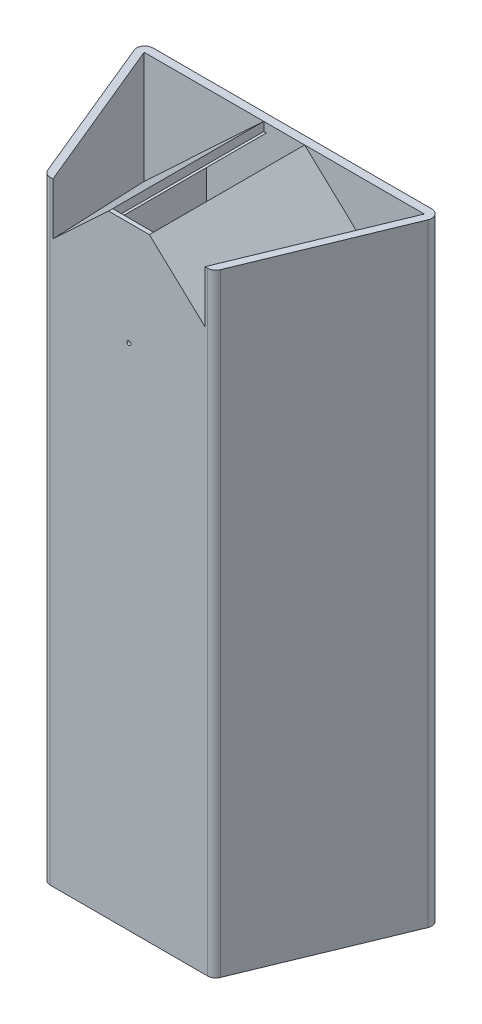
ISO-10303-21;
HEADER;
FILE_DESCRIPTION(('STEP AP214'),'2;1');
FILE_NAME('part.step','',(''),(''),'','','');
FILE_SCHEMA(('AUTOMOTIVE_DESIGN { 1 0 10303 214 1 1 1 1 }'));
ENDSEC;
DATA;
#1=APPLICATION_CONTEXT('core data for automotive mechanical design processes');
#2=APPLICATION_PROTOCOL_DEFINITION('international standard','automotive_design',2000,#1);
#3=PRODUCT_CONTEXT('',#1,'mechanical');
#4=PRODUCT('Part','Part','',(#3));
#5=PRODUCT_RELATED_PRODUCT_CATEGORY('part','',(#4));
#6=PRODUCT_DEFINITION_FORMATION('','',#4);
#7=PRODUCT_DEFINITION_CONTEXT('part definition',#1,'design');
#8=PRODUCT_DEFINITION('design','',#6,#7);
#9=PRODUCT_DEFINITION_SHAPE('','',#8);
#10=(LENGTH_UNIT() NAMED_UNIT(*) SI_UNIT(.MILLI.,.METRE.));
#11=(NAMED_UNIT(*) PLANE_ANGLE_UNIT() SI_UNIT($,.RADIAN.));
#12=(NAMED_UNIT(*) SI_UNIT($,.STERADIAN.) SOLID_ANGLE_UNIT());
#13=UNCERTAINTY_MEASURE_WITH_UNIT(LENGTH_MEASURE(1.E-05),#10,'distance_accuracy_value','');
#14=(GEOMETRIC_REPRESENTATION_CONTEXT(3) GLOBAL_UNCERTAINTY_ASSIGNED_CONTEXT((#13)) GLOBAL_UNIT_ASSIGNED_CONTEXT((#10,
#11,#12)) REPRESENTATION_CONTEXT('',''));
#15=CARTESIAN_POINT('',(0.,0.,0.));
#16=DIRECTION('',(0.,0.,1.));
#17=DIRECTION('',(1.,0.,0.));
#18=AXIS2_PLACEMENT_3D('',#15,#16,#17);
#19=CARTESIAN_POINT('',(185.5,-127.482593081936,176.515464620892));
#20=DIRECTION('',(0.,0.,1.));
#21=DIRECTION('',(1.,0.,0.));
#22=AXIS2_PLACEMENT_3D('',#19,#20,#21);
#23=CYLINDRICAL_SURFACE('',#22,10.);
#24=CARTESIAN_POINT('',(185.5,-127.482593081936,0.));
#25=DIRECTION('',(0.,0.,-1.));
#26=DIRECTION('',(1.,0.,0.));
#27=AXIS2_PLACEMENT_3D('',#24,#25,#26);
#28=CIRCLE('',#27,10.);
#29=CARTESIAN_POINT('',(195.5,-127.482593081936,0.));
#30=VERTEX_POINT('',#29);
#31=EDGE_CURVE('E450',#30,#30,#28,.T.);
#32=ORIENTED_EDGE('',*,*,#31,.T.);
#33=EDGE_LOOP('',(#32));
#34=FACE_BOUND('',#33,.T.);
#35=CARTESIAN_POINT('',(185.5,-127.482593081936,10.));
#36=DIRECTION('',(0.,0.,-1.));
#37=DIRECTION('',(1.,0.,0.));
#38=AXIS2_PLACEMENT_3D('',#35,#36,#37);
#39=CIRCLE('',#38,10.);
#40=CARTESIAN_POINT('',(195.5,-127.482593081936,10.));
#41=VERTEX_POINT('',#40);
#42=EDGE_CURVE('E467',#41,#41,#39,.T.);
#43=ORIENTED_EDGE('',*,*,#42,.F.);
#44=EDGE_LOOP('',(#43));
#45=FACE_BOUND('',#44,.T.);
#46=ADVANCED_FACE('F15',(#34,#45),#23,.F.);
#47=CARTESIAN_POINT('',(185.5,-127.482593081936,176.515464620892));
#48=DIRECTION('',(0.,0.,1.));
#49=DIRECTION('',(1.,0.,0.));
#50=AXIS2_PLACEMENT_3D('',#47,#48,#49);
#51=CYLINDRICAL_SURFACE('',#50,2.5);
#52=CARTESIAN_POINT('',(185.5,-127.482593081936,200.));
#53=DIRECTION('',(0.,0.,-1.));
#54=DIRECTION('',(-1.,0.,0.));
#55=AXIS2_PLACEMENT_3D('',#52,#53,#54);
#56=CIRCLE('',#55,2.5);
#57=CARTESIAN_POINT('',(183.,-127.482593081936,200.));
#58=VERTEX_POINT('',#57);
#59=EDGE_CURVE('E484',#58,#58,#56,.T.);
#60=ORIENTED_EDGE('',*,*,#59,.F.);
#61=EDGE_LOOP('',(#60));
#62=FACE_BOUND('',#61,.T.);
#63=CARTESIAN_POINT('',(185.5,-127.482593081936,190.));
#64=DIRECTION('',(0.,0.,1.));
#65=DIRECTION('',(-1.,0.,0.));
#66=AXIS2_PLACEMENT_3D('',#63,#64,#65);
#67=CIRCLE('',#66,2.5);
#68=CARTESIAN_POINT('',(183.,-127.482593081936,190.));
#69=VERTEX_POINT('',#68);
#70=EDGE_CURVE('E582',#69,#69,#67,.T.);
#71=ORIENTED_EDGE('',*,*,#70,.F.);
#72=EDGE_LOOP('',(#71));
#73=FACE_BOUND('',#72,.T.);
#74=ADVANCED_FACE('F893',(#62,#73),#51,.F.);
#75=CARTESIAN_POINT('',(0.,-10.7827517086493,0.));
#76=DIRECTION('',(0.,1.,0.));
#77=DIRECTION('',(1.,0.,0.));
#78=AXIS2_PLACEMENT_3D('',#75,#76,#77);
#79=PLANE('',#78);
#80=DIRECTION('',(-1.,0.,0.));
#81=VECTOR('',#80,1.);
#82=CARTESIAN_POINT('',(185.5,-10.7827517086493,10.));
#83=LINE('',#82,#81);
#84=CARTESIAN_POINT('',(163.607932789272,-10.7827517086493,10.));
#85=VERTEX_POINT('',#84);
#86=CARTESIAN_POINT('',(160.5,-10.7827517086493,10.));
#87=VERTEX_POINT('',#86);
#88=EDGE_CURVE('E470',#85,#87,#83,.T.);
#89=ORIENTED_EDGE('',*,*,#88,.T.);
#90=DIRECTION('',(0.,0.,1.));
#91=VECTOR('',#90,1.);
#92=CARTESIAN_POINT('',(160.5,-10.7827517086493,125.));
#93=LINE('',#92,#91);
#94=CARTESIAN_POINT('',(160.5,-10.7827517086493,195.));
#95=VERTEX_POINT('',#94);
#96=EDGE_CURVE('E10',#87,#95,#93,.T.);
#97=ORIENTED_EDGE('',*,*,#96,.T.);
#98=DIRECTION('',(1.,0.,0.));
#99=VECTOR('',#98,1.);
#100=CARTESIAN_POINT('',(185.5,-10.7827517086493,195.));
#101=LINE('',#100,#99);
#102=CARTESIAN_POINT('',(210.5,-10.7827517086493,195.));
#103=VERTEX_POINT('',#102);
#104=EDGE_CURVE('E333',#95,#103,#101,.T.);
#105=ORIENTED_EDGE('',*,*,#104,.T.);
#106=DIRECTION('',(0.,0.,-1.));
#107=VECTOR('',#106,1.);
#108=CARTESIAN_POINT('',(210.5,-10.7827517086493,125.));
#109=LINE('',#108,#107);
#110=CARTESIAN_POINT('',(210.5,-10.7827517086493,10.));
#111=VERTEX_POINT('',#110);
#112=EDGE_CURVE('E26',#103,#111,#109,.T.);
#113=ORIENTED_EDGE('',*,*,#112,.T.);
#114=DIRECTION('',(-1.,0.,0.));
#115=VECTOR('',#114,1.);
#116=CARTESIAN_POINT('',(185.5,-10.7827517086493,10.));
#117=LINE('',#116,#115);
#118=CARTESIAN_POINT('',(207.392067210728,-10.7827517086493,10.));
#119=VERTEX_POINT('',#118);
#120=EDGE_CURVE('E345',#111,#119,#117,.T.);
#121=ORIENTED_EDGE('',*,*,#120,.T.);
#122=DIRECTION('',(0.,0.,1.));
#123=VECTOR('',#122,1.);
#124=CARTESIAN_POINT('',(207.392067210728,-10.7827517086493,323.478380407426));
#125=LINE('',#124,#123);
#126=CARTESIAN_POINT('',(207.392067210728,-10.7827517086493,190.));
#127=VERTEX_POINT('',#126);
#128=EDGE_CURVE('E324',#119,#127,#125,.T.);
#129=ORIENTED_EDGE('',*,*,#128,.T.);
#130=DIRECTION('',(1.,0.,0.));
#131=VECTOR('',#130,1.);
#132=CARTESIAN_POINT('',(185.5,-10.7827517086493,190.));
#133=LINE('',#132,#131);
#134=CARTESIAN_POINT('',(163.607932789272,-10.7827517086493,190.));
#135=VERTEX_POINT('',#134);
#136=EDGE_CURVE('E547',#135,#127,#133,.T.);
#137=ORIENTED_EDGE('',*,*,#136,.F.);
#138=DIRECTION('',(0.,0.,1.));
#139=VECTOR('',#138,1.);
#140=CARTESIAN_POINT('',(163.607932789272,-10.7827517086493,323.478380407426));
#141=LINE('',#140,#139);
#142=EDGE_CURVE('E446',#85,#135,#141,.T.);
#143=ORIENTED_EDGE('',*,*,#142,.F.);
#144=EDGE_LOOP('',(#89,#97,#105,#113,#121,#129,#137,#143));
#145=FACE_BOUND('',#144,.T.);
#146=ADVANCED_FACE('F696',(#145),#79,.T.);
#147=CARTESIAN_POINT('',(160.5,-10.7827517086493,125.));
#148=DIRECTION('',(-1.,0.,0.));
#149=DIRECTION('',(0.,0.,1.));
#150=AXIS2_PLACEMENT_3D('',#147,#148,#149);
#151=PLANE('',#150);
#152=DIRECTION('',(0.,0.,1.));
#153=VECTOR('',#152,1.);
#154=CARTESIAN_POINT('',(160.5,0.,125.));
#155=LINE('',#154,#153);
#156=CARTESIAN_POINT('',(160.5,0.,10.));
#157=VERTEX_POINT('',#156);
#158=CARTESIAN_POINT('',(160.5,0.,195.));
#159=VERTEX_POINT('',#158);
#160=EDGE_CURVE('E426',#157,#159,#155,.T.);
#161=ORIENTED_EDGE('',*,*,#160,.T.);
#162=DIRECTION('',(0.,1.,0.));
#163=VECTOR('',#162,1.);
#164=CARTESIAN_POINT('',(160.5,-10.7827517086493,195.));
#165=LINE('',#164,#163);
#166=EDGE_CURVE('E388',#95,#159,#165,.T.);
#167=ORIENTED_EDGE('',*,*,#166,.F.);
#168=ORIENTED_EDGE('',*,*,#96,.F.);
#169=DIRECTION('',(0.,1.,0.));
#170=VECTOR('',#169,1.);
#171=CARTESIAN_POINT('',(160.5,-10.7827517086493,10.));
#172=LINE('',#171,#170);
#173=EDGE_CURVE('E330',#87,#157,#172,.T.);
#174=ORIENTED_EDGE('',*,*,#173,.T.);
#175=EDGE_LOOP('',(#161,#167,#168,#174));
#176=FACE_BOUND('',#175,.T.);
#177=ADVANCED_FACE('F892',(#176),#151,.F.);
#178=CARTESIAN_POINT('',(210.5,-10.7827517086493,125.));
#179=DIRECTION('',(1.,0.,0.));
#180=DIRECTION('',(0.,1.,0.));
#181=AXIS2_PLACEMENT_3D('',#178,#179,#180);
#182=PLANE('',#181);
#183=DIRECTION('',(0.,0.,-1.));
#184=VECTOR('',#183,1.);
#185=CARTESIAN_POINT('',(210.5,0.,125.));
#186=LINE('',#185,#184);
#187=CARTESIAN_POINT('',(210.5,0.,195.));
#188=VERTEX_POINT('',#187);
#189=CARTESIAN_POINT('',(210.5,0.,10.));
#190=VERTEX_POINT('',#189);
#191=EDGE_CURVE('E422',#188,#190,#186,.T.);
#192=ORIENTED_EDGE('',*,*,#191,.T.);
#193=DIRECTION('',(0.,1.,0.));
#194=VECTOR('',#193,1.);
#195=CARTESIAN_POINT('',(210.5,-10.7827517086493,10.));
#196=LINE('',#195,#194);
#197=EDGE_CURVE('E334',#111,#190,#196,.T.);
#198=ORIENTED_EDGE('',*,*,#197,.F.);
#199=ORIENTED_EDGE('',*,*,#112,.F.);
#200=DIRECTION('',(0.,1.,0.));
#201=VECTOR('',#200,1.);
#202=CARTESIAN_POINT('',(210.5,-10.7827517086493,195.));
#203=LINE('',#202,#201);
#204=EDGE_CURVE('E402',#103,#188,#203,.T.);
#205=ORIENTED_EDGE('',*,*,#204,.T.);
#206=EDGE_LOOP('',(#192,#198,#199,#205));
#207=FACE_BOUND('',#206,.T.);
#208=ADVANCED_FACE('F972',(#207),#182,.F.);
#209=CARTESIAN_POINT('',(185.5,-10.7827517086493,195.));
#210=DIRECTION('',(0.,0.,1.));
#211=DIRECTION('',(1.,0.,0.));
#212=AXIS2_PLACEMENT_3D('',#209,#210,#211);
#213=PLANE('',#212);
#214=ORIENTED_EDGE('',*,*,#104,.F.);
#215=ORIENTED_EDGE('',*,*,#166,.T.);
#216=DIRECTION('',(1.,0.,0.));
#217=VECTOR('',#216,1.);
#218=CARTESIAN_POINT('',(185.5,0.,195.));
#219=LINE('',#218,#217);
#220=EDGE_CURVE('E306',#159,#188,#219,.T.);
#221=ORIENTED_EDGE('',*,*,#220,.T.);
#222=ORIENTED_EDGE('',*,*,#204,.F.);
#223=EDGE_LOOP('',(#214,#215,#221,#222));
#224=FACE_BOUND('',#223,.T.);
#225=ADVANCED_FACE('F935',(#224),#213,.F.);
#226=CARTESIAN_POINT('',(14.9423760681599,-780.,10.));
#227=DIRECTION('',(0.,1.,0.));
#228=DIRECTION('',(0.,0.,1.));
#229=AXIS2_PLACEMENT_3D('',#226,#227,#228);
#230=CYLINDRICAL_SURFACE('',#229,10.);
#231=CARTESIAN_POINT('',(14.9423760681599,-750.,10.));
#232=DIRECTION('',(0.,-1.,0.));
#233=DIRECTION('',(0.,0.,-1.));
#234=AXIS2_PLACEMENT_3D('',#231,#232,#233);
#235=CIRCLE('',#234,10.);
#236=CARTESIAN_POINT('',(5.69799005718069,-750.,13.8133092295289));
#237=VERTEX_POINT('',#236);
#238=CARTESIAN_POINT('',(14.9423760681599,-750.,0.));
#239=VERTEX_POINT('',#238);
#240=EDGE_CURVE('E459',#237,#239,#235,.T.);
#241=ORIENTED_EDGE('',*,*,#240,.F.);
#242=DIRECTION('',(0.,-1.,0.));
#243=VECTOR('',#242,1.);
#244=CARTESIAN_POINT('',(5.69799005718068,-780.,13.8133092295289));
#245=LINE('',#244,#243);
#246=CARTESIAN_POINT('',(5.69799005718069,0.,13.8133092295289));
#247=VERTEX_POINT('',#246);
#248=EDGE_CURVE('E496',#247,#237,#245,.T.);
#249=ORIENTED_EDGE('',*,*,#248,.F.);
#250=CARTESIAN_POINT('',(14.9423760681599,0.,10.));
#251=DIRECTION('',(0.,1.,0.));
#252=DIRECTION('',(0.,0.,-1.));
#253=AXIS2_PLACEMENT_3D('',#250,#251,#252);
#254=CIRCLE('',#253,10.);
#255=CARTESIAN_POINT('',(14.9423760681599,0.,0.));
#256=VERTEX_POINT('',#255);
#257=EDGE_CURVE('E317',#256,#247,#254,.T.);
#258=ORIENTED_EDGE('',*,*,#257,.F.);
#259=DIRECTION('',(0.,1.,0.));
#260=VECTOR('',#259,1.);
#261=CARTESIAN_POINT('',(14.9423760681599,-780.,0.));
#262=LINE('',#261,#260);
#263=EDGE_CURVE('E451',#239,#256,#262,.T.);
#264=ORIENTED_EDGE('',*,*,#263,.F.);
#265=EDGE_LOOP('',(#241,#249,#258,#264));
#266=FACE_BOUND('',#265,.T.);
#267=ADVANCED_FACE('F868',(#266),#230,.T.);
#268=CARTESIAN_POINT('',(89.19237606816,-780.,190.));
#269=DIRECTION('',(0.,1.,0.));
#270=DIRECTION('',(0.,0.,1.));
#271=AXIS2_PLACEMENT_3D('',#268,#269,#270);
#272=CYLINDRICAL_SURFACE('',#271,10.);
#273=CARTESIAN_POINT('',(89.19237606816,-750.,190.));
#274=DIRECTION('',(0.,-1.,0.));
#275=DIRECTION('',(0.,0.,-1.));
#276=AXIS2_PLACEMENT_3D('',#273,#274,#275);
#277=CIRCLE('',#276,10.);
#278=CARTESIAN_POINT('',(89.19237606816,-750.,200.));
#279=VERTEX_POINT('',#278);
#280=CARTESIAN_POINT('',(79.9479900571807,-750.,193.813309229529));
#281=VERTEX_POINT('',#280);
#282=EDGE_CURVE('E338',#279,#281,#277,.T.);
#283=ORIENTED_EDGE('',*,*,#282,.F.);
#284=DIRECTION('',(0.,-1.,0.));
#285=VECTOR('',#284,1.);
#286=CARTESIAN_POINT('',(89.19237606816,-780.,200.));
#287=LINE('',#286,#285);
#288=CARTESIAN_POINT('',(89.19237606816,0.,200.));
#289=VERTEX_POINT('',#288);
#290=EDGE_CURVE('E508',#289,#279,#287,.T.);
#291=ORIENTED_EDGE('',*,*,#290,.F.);
#292=CARTESIAN_POINT('',(89.19237606816,0.,190.));
#293=DIRECTION('',(0.,1.,0.));
#294=DIRECTION('',(0.,0.,-1.));
#295=AXIS2_PLACEMENT_3D('',#292,#293,#294);
#296=CIRCLE('',#295,10.);
#297=CARTESIAN_POINT('',(79.9479900571807,0.,193.813309229529));
#298=VERTEX_POINT('',#297);
#299=EDGE_CURVE('E392',#298,#289,#296,.T.);
#300=ORIENTED_EDGE('',*,*,#299,.F.);
#301=DIRECTION('',(0.,1.,0.));
#302=VECTOR('',#301,1.);
#303=CARTESIAN_POINT('',(79.9479900571807,-780.,193.813309229529));
#304=LINE('',#303,#302);
#305=EDGE_CURVE('E325',#281,#298,#304,.T.);
#306=ORIENTED_EDGE('',*,*,#305,.F.);
#307=EDGE_LOOP('',(#283,#291,#300,#306));
#308=FACE_BOUND('',#307,.T.);
#309=ADVANCED_FACE('F637',(#308),#272,.T.);
#310=CARTESIAN_POINT('',(281.80762393184,-780.,190.));
#311=DIRECTION('',(0.,1.,0.));
#312=DIRECTION('',(0.,0.,1.));
#313=AXIS2_PLACEMENT_3D('',#310,#311,#312);
#314=CYLINDRICAL_SURFACE('',#313,10.);
#315=CARTESIAN_POINT('',(281.80762393184,-750.,190.));
#316=DIRECTION('',(0.,-1.,0.));
#317=DIRECTION('',(0.,0.,-1.));
#318=AXIS2_PLACEMENT_3D('',#315,#316,#317);
#319=CIRCLE('',#318,10.);
#320=CARTESIAN_POINT('',(291.052009942819,-750.,193.813309229529));
#321=VERTEX_POINT('',#320);
#322=CARTESIAN_POINT('',(281.80762393184,-750.,200.));
#323=VERTEX_POINT('',#322);
#324=EDGE_CURVE('E463',#321,#323,#319,.T.);
#325=ORIENTED_EDGE('',*,*,#324,.F.);
#326=DIRECTION('',(0.,-1.,0.));
#327=VECTOR('',#326,1.);
#328=CARTESIAN_POINT('',(291.052009942819,-780.,193.813309229529));
#329=LINE('',#328,#327);
#330=CARTESIAN_POINT('',(291.052009942819,0.,193.813309229529));
#331=VERTEX_POINT('',#330);
#332=EDGE_CURVE('E413',#331,#321,#329,.T.);
#333=ORIENTED_EDGE('',*,*,#332,.F.);
#334=CARTESIAN_POINT('',(281.80762393184,0.,190.));
#335=DIRECTION('',(0.,1.,0.));
#336=DIRECTION('',(0.,0.,-1.));
#337=AXIS2_PLACEMENT_3D('',#334,#335,#336);
#338=CIRCLE('',#337,10.);
#339=CARTESIAN_POINT('',(281.80762393184,0.,200.));
#340=VERTEX_POINT('',#339);
#341=EDGE_CURVE('E577',#340,#331,#338,.T.);
#342=ORIENTED_EDGE('',*,*,#341,.F.);
#343=DIRECTION('',(0.,1.,0.));
#344=VECTOR('',#343,1.);
#345=CARTESIAN_POINT('',(281.80762393184,-780.,200.));
#346=LINE('',#345,#344);
#347=EDGE_CURVE('E507',#323,#340,#346,.T.);
#348=ORIENTED_EDGE('',*,*,#347,.F.);
#349=EDGE_LOOP('',(#325,#333,#342,#348));
#350=FACE_BOUND('',#349,.T.);
#351=ADVANCED_FACE('F650',(#350),#314,.T.);
#352=CARTESIAN_POINT('',(341.11524786368,-780.,20.));
#353=DIRECTION('',(0.,1.,0.));
#354=DIRECTION('',(0.,0.,1.));
#355=AXIS2_PLACEMENT_3D('',#352,#353,#354);
#356=CYLINDRICAL_SURFACE('',#355,10.);
#357=CARTESIAN_POINT('',(341.11524786368,-191.613088613741,20.));
#358=DIRECTION('',(-0.531514406890806,-0.847049251972702,0.));
#359=DIRECTION('',(-0.847049251972702,0.531514406890806,0.));
#360=AXIS2_PLACEMENT_3D('',#357,#358,#359);
#361=ELLIPSE('',#360,11.8056889569419,10.);
#362=CARTESIAN_POINT('',(341.11524786368,-191.613088613741,10.));
#363=VERTEX_POINT('',#362);
#364=CARTESIAN_POINT('',(350.359633874659,-197.413842626867,23.8133092295289));
#365=VERTEX_POINT('',#364);
#366=EDGE_CURVE('E258',#363,#365,#361,.T.);
#367=ORIENTED_EDGE('',*,*,#366,.F.);
#368=DIRECTION('',(0.,1.,0.));
#369=VECTOR('',#368,1.);
#370=CARTESIAN_POINT('',(341.11524786368,-200.989270854515,10.));
#371=LINE('',#370,#369);
#372=CARTESIAN_POINT('',(341.11524786368,-750.,10.));
#373=VERTEX_POINT('',#372);
#374=EDGE_CURVE('E399',#373,#363,#371,.T.);
#375=ORIENTED_EDGE('',*,*,#374,.F.);
#376=CARTESIAN_POINT('',(341.11524786368,-750.,20.));
#377=DIRECTION('',(0.,1.,0.));
#378=DIRECTION('',(0.,0.,-1.));
#379=AXIS2_PLACEMENT_3D('',#376,#377,#378);
#380=CIRCLE('',#379,10.);
#381=CARTESIAN_POINT('',(350.359633874659,-750.,23.8133092295289));
#382=VERTEX_POINT('',#381);
#383=EDGE_CURVE('E276',#382,#373,#380,.T.);
#384=ORIENTED_EDGE('',*,*,#383,.F.);
#385=DIRECTION('',(0.,-1.,0.));
#386=VECTOR('',#385,1.);
#387=CARTESIAN_POINT('',(350.359633874659,-750.,23.8133092295289));
#388=LINE('',#387,#386);
#389=EDGE_CURVE('E273',#365,#382,#388,.T.);
#390=ORIENTED_EDGE('',*,*,#389,.F.);
#391=EDGE_LOOP('',(#367,#375,#384,#390));
#392=FACE_BOUND('',#391,.T.);
#393=ADVANCED_FACE('F274',(#392),#356,.F.);
#394=CARTESIAN_POINT('',(29.8847521363199,0.,20.));
#395=DIRECTION('',(0.,1.,0.));
#396=DIRECTION('',(0.,0.,1.));
#397=AXIS2_PLACEMENT_3D('',#394,#395,#396);
#398=CYLINDRICAL_SURFACE('',#397,10.);
#399=CARTESIAN_POINT('',(29.8847521363199,-191.613088613741,20.));
#400=DIRECTION('',(0.531514406890807,-0.847049251972702,0.));
#401=DIRECTION('',(0.847049251972702,0.531514406890807,0.));
#402=AXIS2_PLACEMENT_3D('',#399,#400,#401);
#403=ELLIPSE('',#402,11.8056889569419,10.);
#404=CARTESIAN_POINT('',(20.6403661253407,-197.413842626867,23.813309229529));
#405=VERTEX_POINT('',#404);
#406=CARTESIAN_POINT('',(29.8847521363199,-191.613088613741,10.));
#407=VERTEX_POINT('',#406);
#408=EDGE_CURVE('E353',#405,#407,#403,.T.);
#409=ORIENTED_EDGE('',*,*,#408,.F.);
#410=DIRECTION('',(0.,1.,0.));
#411=VECTOR('',#410,1.);
#412=CARTESIAN_POINT('',(20.6403661253407,-200.989270854516,23.813309229529));
#413=LINE('',#412,#411);
#414=CARTESIAN_POINT('',(20.6403661253407,-750.,23.813309229529));
#415=VERTEX_POINT('',#414);
#416=EDGE_CURVE('E363',#415,#405,#413,.T.);
#417=ORIENTED_EDGE('',*,*,#416,.F.);
#418=CARTESIAN_POINT('',(29.8847521363199,-750.,20.));
#419=DIRECTION('',(0.,1.,0.));
#420=DIRECTION('',(0.,0.,-1.));
#421=AXIS2_PLACEMENT_3D('',#418,#419,#420);
#422=CIRCLE('',#421,10.);
#423=CARTESIAN_POINT('',(29.8847521363199,-750.,10.));
#424=VERTEX_POINT('',#423);
#425=EDGE_CURVE('E352',#424,#415,#422,.T.);
#426=ORIENTED_EDGE('',*,*,#425,.F.);
#427=DIRECTION('',(0.,-1.,0.));
#428=VECTOR('',#427,1.);
#429=CARTESIAN_POINT('',(29.8847521363199,-750.,10.));
#430=LINE('',#429,#428);
#431=EDGE_CURVE('E473',#407,#424,#430,.T.);
#432=ORIENTED_EDGE('',*,*,#431,.F.);
#433=EDGE_LOOP('',(#409,#417,#426,#432));
#434=FACE_BOUND('',#433,.T.);
#435=ADVANCED_FACE('F978',(#434),#398,.F.);
#436=CARTESIAN_POINT('',(80.5,-148.046869339063,200.));
#437=DIRECTION('',(0.,0.,-1.));
#438=DIRECTION('',(-1.,0.,0.));
#439=AXIS2_PLACEMENT_3D('',#436,#437,#438);
#440=CYLINDRICAL_SURFACE('',#439,10.);
#441=CARTESIAN_POINT('',(80.5,-148.046869339063,168.927573168097));
#442=DIRECTION('',(-0.924438601097928,0.,0.381330922952895));
#443=DIRECTION('',(-0.381330922952895,0.,-0.924438601097928));
#444=AXIS2_PLACEMENT_3D('',#441,#442,#443);
#445=ELLIPSE('',#444,26.2239419834181,10.);
#446=CARTESIAN_POINT('',(85.8151440689081,-156.51736185879,181.812770910905));
#447=VERTEX_POINT('',#446);
#448=CARTESIAN_POINT('',(89.19237606816,-152.990814958675,190.));
#449=VERTEX_POINT('',#448);
#450=EDGE_CURVE('E19',#447,#449,#445,.T.);
#451=ORIENTED_EDGE('',*,*,#450,.F.);
#452=DIRECTION('',(0.,0.,1.));
#453=VECTOR('',#452,1.);
#454=CARTESIAN_POINT('',(85.8151440689081,-156.51736185879,200.));
#455=LINE('',#454,#453);
#456=CARTESIAN_POINT('',(85.8151440689081,-156.51736185879,10.));
#457=VERTEX_POINT('',#456);
#458=EDGE_CURVE('E396',#457,#447,#455,.T.);
#459=ORIENTED_EDGE('',*,*,#458,.F.);
#460=CARTESIAN_POINT('',(80.5,-148.046869339063,10.));
#461=DIRECTION('',(0.,0.,-1.));
#462=DIRECTION('',(1.,0.,0.));
#463=AXIS2_PLACEMENT_3D('',#460,#461,#462);
#464=CIRCLE('',#463,10.);
#465=CARTESIAN_POINT('',(90.5,-148.046869339063,10.));
#466=VERTEX_POINT('',#465);
#467=EDGE_CURVE('E488',#466,#457,#464,.T.);
#468=ORIENTED_EDGE('',*,*,#467,.F.);
#469=DIRECTION('',(0.,0.,-1.));
#470=VECTOR('',#469,1.);
#471=CARTESIAN_POINT('',(90.5,-148.046869339063,200.));
#472=LINE('',#471,#470);
#473=CARTESIAN_POINT('',(90.5,-148.046869339063,190.));
#474=VERTEX_POINT('',#473);
#475=EDGE_CURVE('E373',#474,#466,#472,.T.);
#476=ORIENTED_EDGE('',*,*,#475,.F.);
#477=CARTESIAN_POINT('',(80.5,-148.046869339063,190.));
#478=DIRECTION('',(0.,0.,1.));
#479=DIRECTION('',(-1.,0.,0.));
#480=AXIS2_PLACEMENT_3D('',#477,#478,#479);
#481=CIRCLE('',#480,10.);
#482=EDGE_CURVE('E311',#449,#474,#481,.T.);
#483=ORIENTED_EDGE('',*,*,#482,.F.);
#484=EDGE_LOOP('',(#451,#459,#468,#476,#483));
#485=FACE_BOUND('',#484,.T.);
#486=ADVANCED_FACE('F725',(#485),#440,.T.);
#487=CARTESIAN_POINT('',(290.5,-148.046869339063,200.));
#488=DIRECTION('',(0.,0.,-1.));
#489=DIRECTION('',(-1.,0.,0.));
#490=AXIS2_PLACEMENT_3D('',#487,#488,#489);
#491=CYLINDRICAL_SURFACE('',#490,10.);
#492=CARTESIAN_POINT('',(290.5,-148.046869339063,190.));
#493=DIRECTION('',(0.,0.,1.));
#494=DIRECTION('',(-1.,0.,0.));
#495=AXIS2_PLACEMENT_3D('',#492,#493,#494);
#496=CIRCLE('',#495,10.);
#497=CARTESIAN_POINT('',(280.5,-148.046869339063,190.));
#498=VERTEX_POINT('',#497);
#499=CARTESIAN_POINT('',(281.80762393184,-152.990814958675,190.));
#500=VERTEX_POINT('',#499);
#501=EDGE_CURVE('E509',#498,#500,#496,.T.);
#502=ORIENTED_EDGE('',*,*,#501,.F.);
#503=DIRECTION('',(0.,0.,1.));
#504=VECTOR('',#503,1.);
#505=CARTESIAN_POINT('',(280.5,-148.046869339063,200.));
#506=LINE('',#505,#504);
#507=CARTESIAN_POINT('',(280.5,-148.046869339063,10.));
#508=VERTEX_POINT('',#507);
#509=EDGE_CURVE('E381',#508,#498,#506,.T.);
#510=ORIENTED_EDGE('',*,*,#509,.F.);
#511=CARTESIAN_POINT('',(290.5,-148.046869339063,10.));
#512=DIRECTION('',(0.,0.,-1.));
#513=DIRECTION('',(1.,0.,0.));
#514=AXIS2_PLACEMENT_3D('',#511,#512,#513);
#515=CIRCLE('',#514,10.);
#516=CARTESIAN_POINT('',(285.184855931092,-156.51736185879,10.));
#517=VERTEX_POINT('',#516);
#518=EDGE_CURVE('E348',#517,#508,#515,.T.);
#519=ORIENTED_EDGE('',*,*,#518,.F.);
#520=DIRECTION('',(0.,0.,-1.));
#521=VECTOR('',#520,1.);
#522=CARTESIAN_POINT('',(285.184855931092,-156.51736185879,200.));
#523=LINE('',#522,#521);
#524=CARTESIAN_POINT('',(285.184855931092,-156.51736185879,181.812770910905));
#525=VERTEX_POINT('',#524);
#526=EDGE_CURVE('E269',#525,#517,#523,.T.);
#527=ORIENTED_EDGE('',*,*,#526,.F.);
#528=CARTESIAN_POINT('',(290.5,-148.046869339063,168.927573168097));
#529=DIRECTION('',(0.924438601097928,0.,0.381330922952895));
#530=DIRECTION('',(0.381330922952895,0.,-0.924438601097928));
#531=AXIS2_PLACEMENT_3D('',#528,#529,#530);
#532=ELLIPSE('',#531,26.2239419834181,10.);
#533=EDGE_CURVE('E287',#500,#525,#532,.T.);
#534=ORIENTED_EDGE('',*,*,#533,.F.);
#535=EDGE_LOOP('',(#502,#510,#519,#527,#534));
#536=FACE_BOUND('',#535,.T.);
#537=ADVANCED_FACE('F712',(#536),#491,.T.);
#538=CARTESIAN_POINT('',(356.05762393184,-780.,10.));
#539=DIRECTION('',(0.,1.,0.));
#540=DIRECTION('',(0.,0.,1.));
#541=AXIS2_PLACEMENT_3D('',#538,#539,#540);
#542=CYLINDRICAL_SURFACE('',#541,10.);
#543=CARTESIAN_POINT('',(356.05762393184,-750.,10.));
#544=DIRECTION('',(0.,-1.,0.));
#545=DIRECTION('',(0.,0.,-1.));
#546=AXIS2_PLACEMENT_3D('',#543,#544,#545);
#547=CIRCLE('',#546,10.);
#548=CARTESIAN_POINT('',(356.05762393184,-750.,0.));
#549=VERTEX_POINT('',#548);
#550=CARTESIAN_POINT('',(365.302009942819,-750.,13.8133092295289));
#551=VERTEX_POINT('',#550);
#552=EDGE_CURVE('E460',#549,#551,#547,.T.);
#553=ORIENTED_EDGE('',*,*,#552,.F.);
#554=DIRECTION('',(0.,-1.,0.));
#555=VECTOR('',#554,1.);
#556=CARTESIAN_POINT('',(356.05762393184,-780.,0.));
#557=LINE('',#556,#555);
#558=CARTESIAN_POINT('',(356.05762393184,0.,0.));
#559=VERTEX_POINT('',#558);
#560=EDGE_CURVE('E455',#559,#549,#557,.T.);
#561=ORIENTED_EDGE('',*,*,#560,.F.);
#562=CARTESIAN_POINT('',(356.05762393184,0.,10.));
#563=DIRECTION('',(0.,1.,0.));
#564=DIRECTION('',(0.,0.,-1.));
#565=AXIS2_PLACEMENT_3D('',#562,#563,#564);
#566=CIRCLE('',#565,10.);
#567=CARTESIAN_POINT('',(365.302009942819,0.,13.813309229529));
#568=VERTEX_POINT('',#567);
#569=EDGE_CURVE('E318',#568,#559,#566,.T.);
#570=ORIENTED_EDGE('',*,*,#569,.F.);
#571=DIRECTION('',(0.,1.,0.));
#572=VECTOR('',#571,1.);
#573=CARTESIAN_POINT('',(365.302009942819,-780.,13.8133092295289));
#574=LINE('',#573,#572);
#575=EDGE_CURVE('E412',#551,#568,#574,.T.);
#576=ORIENTED_EDGE('',*,*,#575,.F.);
#577=EDGE_LOOP('',(#553,#561,#570,#576));
#578=FACE_BOUND('',#577,.T.);
#579=ADVANCED_FACE('F905',(#578),#542,.T.);
#580=CARTESIAN_POINT('',(356.05762393184,0.,10.));
#581=DIRECTION('',(0.,0.,1.));
#582=DIRECTION('',(1.,0.,0.));
#583=AXIS2_PLACEMENT_3D('',#580,#581,#582);
#584=PLANE('',#583);
#585=ORIENTED_EDGE('',*,*,#88,.F.);
#586=DIRECTION('',(-0.730600984463315,-0.68280465837693,0.));
#587=VECTOR('',#586,1.);
#588=CARTESIAN_POINT('',(6.82804658376926,-157.306009844633,10.));
#589=LINE('',#588,#587);
#590=CARTESIAN_POINT('',(90.5,-79.1079225397446,10.));
#591=VERTEX_POINT('',#590);
#592=EDGE_CURVE('E442',#85,#591,#589,.T.);
#593=ORIENTED_EDGE('',*,*,#592,.T.);
#594=DIRECTION('',(0.,1.,0.));
#595=VECTOR('',#594,1.);
#596=CARTESIAN_POINT('',(90.5,-153.577664532119,10.));
#597=LINE('',#596,#595);
#598=EDGE_CURVE('E358',#466,#591,#597,.T.);
#599=ORIENTED_EDGE('',*,*,#598,.F.);
#600=ORIENTED_EDGE('',*,*,#467,.T.);
#601=DIRECTION('',(0.847049251972702,0.531514406890807,0.));
#602=VECTOR('',#601,1.);
#603=CARTESIAN_POINT('',(10.8173760681599,-203.577664532119,10.));
#604=LINE('',#603,#602);
#605=EDGE_CURVE('E357',#407,#457,#604,.T.);
#606=ORIENTED_EDGE('',*,*,#605,.F.);
#607=ORIENTED_EDGE('',*,*,#431,.T.);
#608=DIRECTION('',(-1.,0.,0.));
#609=VECTOR('',#608,1.);
#610=CARTESIAN_POINT('',(356.05762393184,-750.,10.));
#611=LINE('',#610,#609);
#612=EDGE_CURVE('E337',#373,#424,#611,.T.);
#613=ORIENTED_EDGE('',*,*,#612,.F.);
#614=ORIENTED_EDGE('',*,*,#374,.T.);
#615=DIRECTION('',(-0.847049251972702,0.531514406890806,0.));
#616=VECTOR('',#615,1.);
#617=CARTESIAN_POINT('',(360.18262393184,-203.577664532119,10.));
#618=LINE('',#617,#616);
#619=EDGE_CURVE('E265',#363,#517,#618,.T.);
#620=ORIENTED_EDGE('',*,*,#619,.T.);
#621=ORIENTED_EDGE('',*,*,#518,.T.);
#622=DIRECTION('',(0.,1.,0.));
#623=VECTOR('',#622,1.);
#624=CARTESIAN_POINT('',(280.5,-153.577664532118,10.));
#625=LINE('',#624,#623);
#626=CARTESIAN_POINT('',(280.5,-79.1079225397446,10.));
#627=VERTEX_POINT('',#626);
#628=EDGE_CURVE('E384',#508,#627,#625,.T.);
#629=ORIENTED_EDGE('',*,*,#628,.T.);
#630=DIRECTION('',(0.730600984463315,-0.682804658376929,0.));
#631=VECTOR('',#630,1.);
#632=CARTESIAN_POINT('',(203.671953416231,-7.30600984463311,10.));
#633=LINE('',#632,#631);
#634=EDGE_CURVE('E319',#119,#627,#633,.T.);
#635=ORIENTED_EDGE('',*,*,#634,.F.);
#636=ORIENTED_EDGE('',*,*,#120,.F.);
#637=ORIENTED_EDGE('',*,*,#197,.T.);
#638=DIRECTION('',(-1.,0.,0.));
#639=VECTOR('',#638,1.);
#640=CARTESIAN_POINT('',(160.5,0.,10.));
#641=LINE('',#640,#639);
#642=EDGE_CURVE('E339',#190,#157,#641,.T.);
#643=ORIENTED_EDGE('',*,*,#642,.T.);
#644=ORIENTED_EDGE('',*,*,#173,.F.);
#645=EDGE_LOOP('',(#585,#593,#599,#600,#606,#607,#613,#614,#620,#621,#629,#635,#636,#637,#643,#644));
#646=FACE_BOUND('',#645,.T.);
#647=ORIENTED_EDGE('',*,*,#42,.T.);
#648=EDGE_LOOP('',(#647));
#649=FACE_BOUND('',#648,.T.);
#650=ADVANCED_FACE('F736',(#646,#649),#584,.T.);
#651=CARTESIAN_POINT('',(360.18262393184,-203.577664532119,200.));
#652=DIRECTION('',(-0.531514406890806,-0.847049251972702,0.));
#653=DIRECTION('',(-0.847049251972702,0.531514406890806,0.));
#654=AXIS2_PLACEMENT_3D('',#651,#652,#653);
#655=PLANE('',#654);
#656=ORIENTED_EDGE('',*,*,#619,.F.);
#657=ORIENTED_EDGE('',*,*,#366,.T.);
#658=DIRECTION('',(-0.37086176346847,0.232711816685218,0.899058820529626));
#659=VECTOR('',#658,1.);
#660=CARTESIAN_POINT('',(333.38570326797,-186.762881495611,64.9622319124135));
#661=LINE('',#660,#659);
#662=EDGE_CURVE('E263',#365,#525,#661,.T.);
#663=ORIENTED_EDGE('',*,*,#662,.T.);
#664=ORIENTED_EDGE('',*,*,#526,.T.);
#665=EDGE_LOOP('',(#656,#657,#663,#664));
#666=FACE_BOUND('',#665,.T.);
#667=ADVANCED_FACE('F260',(#666),#655,.T.);
#668=CARTESIAN_POINT('',(280.5,-153.577664532118,200.));
#669=DIRECTION('',(-1.,0.,0.));
#670=DIRECTION('',(0.,0.,1.));
#671=AXIS2_PLACEMENT_3D('',#668,#669,#670);
#672=PLANE('',#671);
#673=ORIENTED_EDGE('',*,*,#628,.F.);
#674=ORIENTED_EDGE('',*,*,#509,.T.);
#675=DIRECTION('',(0.,1.,0.));
#676=VECTOR('',#675,1.);
#677=CARTESIAN_POINT('',(280.5,-780.,190.));
#678=LINE('',#677,#676);
#679=CARTESIAN_POINT('',(280.5,-79.1079225397446,190.));
#680=VERTEX_POINT('',#679);
#681=EDGE_CURVE('E514',#498,#680,#678,.T.);
#682=ORIENTED_EDGE('',*,*,#681,.T.);
#683=DIRECTION('',(0.,0.,-1.));
#684=VECTOR('',#683,1.);
#685=CARTESIAN_POINT('',(280.5,-79.1079225397446,200.));
#686=LINE('',#685,#684);
#687=EDGE_CURVE('E323',#680,#627,#686,.T.);
#688=ORIENTED_EDGE('',*,*,#687,.T.);
#689=EDGE_LOOP('',(#673,#674,#682,#688));
#690=FACE_BOUND('',#689,.T.);
#691=ADVANCED_FACE('F705',(#690),#672,.T.);
#692=CARTESIAN_POINT('',(10.8173760681599,-203.577664532119,200.));
#693=DIRECTION('',(-0.531514406890807,0.847049251972702,0.));
#694=DIRECTION('',(0.,0.,1.));
#695=AXIS2_PLACEMENT_3D('',#692,#693,#694);
#696=PLANE('',#695);
#697=DIRECTION('',(0.370861763468471,0.232711816685219,0.899058820529625));
#698=VECTOR('',#697,1.);
#699=CARTESIAN_POINT('',(37.6142967320304,-186.762881495611,64.9622319124131));
#700=LINE('',#699,#698);
#701=EDGE_CURVE('E359',#405,#447,#700,.T.);
#702=ORIENTED_EDGE('',*,*,#701,.F.);
#703=ORIENTED_EDGE('',*,*,#408,.T.);
#704=ORIENTED_EDGE('',*,*,#605,.T.);
#705=ORIENTED_EDGE('',*,*,#458,.T.);
#706=EDGE_LOOP('',(#702,#703,#704,#705));
#707=FACE_BOUND('',#706,.T.);
#708=ADVANCED_FACE('F880',(#707),#696,.F.);
#709=CARTESIAN_POINT('',(90.5,-153.577664532119,200.));
#710=DIRECTION('',(-1.,0.,0.));
#711=DIRECTION('',(0.,0.,1.));
#712=AXIS2_PLACEMENT_3D('',#709,#710,#711);
#713=PLANE('',#712);
#714=DIRECTION('',(0.,1.,0.));
#715=VECTOR('',#714,1.);
#716=CARTESIAN_POINT('',(90.5,-780.,190.));
#717=LINE('',#716,#715);
#718=CARTESIAN_POINT('',(90.5,-79.1079225397446,190.));
#719=VERTEX_POINT('',#718);
#720=EDGE_CURVE('E421',#474,#719,#717,.T.);
#721=ORIENTED_EDGE('',*,*,#720,.F.);
#722=ORIENTED_EDGE('',*,*,#475,.T.);
#723=ORIENTED_EDGE('',*,*,#598,.T.);
#724=DIRECTION('',(0.,0.,-1.));
#725=VECTOR('',#724,1.);
#726=CARTESIAN_POINT('',(90.5,-79.1079225397446,200.));
#727=LINE('',#726,#725);
#728=EDGE_CURVE('E427',#719,#591,#727,.T.);
#729=ORIENTED_EDGE('',*,*,#728,.F.);
#730=EDGE_LOOP('',(#721,#722,#723,#729));
#731=FACE_BOUND('',#730,.T.);
#732=ADVANCED_FACE('F730',(#731),#713,.F.);
#733=CARTESIAN_POINT('',(0.,-750.,0.));
#734=DIRECTION('',(0.,-1.,0.));
#735=DIRECTION('',(0.,0.,-1.));
#736=AXIS2_PLACEMENT_3D('',#733,#734,#735);
#737=PLANE('',#736);
#738=DIRECTION('',(-0.381330922952895,0.,-0.924438601097928));
#739=VECTOR('',#738,1.);
#740=CARTESIAN_POINT('',(9.24438601097925,-750.,-3.81330922952894));
#741=LINE('',#740,#739);
#742=CARTESIAN_POINT('',(89.19237606816,-750.,190.));
#743=VERTEX_POINT('',#742);
#744=EDGE_CURVE('E328',#743,#415,#741,.T.);
#745=ORIENTED_EDGE('',*,*,#744,.F.);
#746=DIRECTION('',(-1.,0.,0.));
#747=VECTOR('',#746,1.);
#748=CARTESIAN_POINT('',(0.,-750.,190.));
#749=LINE('',#748,#747);
#750=CARTESIAN_POINT('',(281.80762393184,-750.,190.));
#751=VERTEX_POINT('',#750);
#752=EDGE_CURVE('E312',#751,#743,#749,.T.);
#753=ORIENTED_EDGE('',*,*,#752,.F.);
#754=DIRECTION('',(-0.381330922952895,0.,0.924438601097928));
#755=VECTOR('',#754,1.);
#756=CARTESIAN_POINT('',(307.807289780181,-750.,126.970507034325));
#757=LINE('',#756,#755);
#758=EDGE_CURVE('E281',#382,#751,#757,.T.);
#759=ORIENTED_EDGE('',*,*,#758,.F.);
#760=ORIENTED_EDGE('',*,*,#383,.T.);
#761=ORIENTED_EDGE('',*,*,#612,.T.);
#762=ORIENTED_EDGE('',*,*,#425,.T.);
#763=EDGE_LOOP('',(#745,#753,#759,#760,#761,#762));
#764=FACE_BOUND('',#763,.T.);
#765=DIRECTION('',(-0.381330922952895,0.,-0.924438601097928));
#766=VECTOR('',#765,1.);
#767=CARTESIAN_POINT('',(82.5,-750.,200.));
#768=LINE('',#767,#766);
#769=EDGE_CURVE('E329',#281,#237,#768,.T.);
#770=ORIENTED_EDGE('',*,*,#769,.T.);
#771=ORIENTED_EDGE('',*,*,#240,.T.);
#772=DIRECTION('',(1.,0.,0.));
#773=VECTOR('',#772,1.);
#774=CARTESIAN_POINT('',(0.,-750.,0.));
#775=LINE('',#774,#773);
#776=EDGE_CURVE('E456',#239,#549,#775,.T.);
#777=ORIENTED_EDGE('',*,*,#776,.T.);
#778=ORIENTED_EDGE('',*,*,#552,.T.);
#779=DIRECTION('',(-0.381330922952895,0.,0.924438601097928));
#780=VECTOR('',#779,1.);
#781=CARTESIAN_POINT('',(288.5,-750.,200.));
#782=LINE('',#781,#780);
#783=EDGE_CURVE('E408',#551,#321,#782,.T.);
#784=ORIENTED_EDGE('',*,*,#783,.T.);
#785=ORIENTED_EDGE('',*,*,#324,.T.);
#786=DIRECTION('',(-1.,0.,0.));
#787=VECTOR('',#786,1.);
#788=CARTESIAN_POINT('',(185.5,-750.,200.));
#789=LINE('',#788,#787);
#790=EDGE_CURVE('E503',#323,#279,#789,.T.);
#791=ORIENTED_EDGE('',*,*,#790,.T.);
#792=ORIENTED_EDGE('',*,*,#282,.T.);
#793=EDGE_LOOP('',(#770,#771,#777,#778,#784,#785,#791,#792));
#794=FACE_BOUND('',#793,.T.);
#795=ADVANCED_FACE('F640',(#764,#794),#737,.T.);
#796=CARTESIAN_POINT('',(288.5,-780.,200.));
#797=DIRECTION('',(-0.924438601097928,0.,-0.381330922952895));
#798=DIRECTION('',(-0.381330922952895,0.,0.924438601097928));
#799=AXIS2_PLACEMENT_3D('',#796,#797,#798);
#800=PLANE('',#799);
#801=DIRECTION('',(-0.381330922952895,0.,0.924438601097928));
#802=VECTOR('',#801,1.);
#803=CARTESIAN_POINT('',(371.,0.,0.));
#804=LINE('',#803,#802);
#805=EDGE_CURVE('E298',#568,#331,#804,.T.);
#806=ORIENTED_EDGE('',*,*,#805,.T.);
#807=ORIENTED_EDGE('',*,*,#332,.T.);
#808=ORIENTED_EDGE('',*,*,#783,.F.);
#809=ORIENTED_EDGE('',*,*,#575,.T.);
#810=EDGE_LOOP('',(#806,#807,#808,#809));
#811=FACE_BOUND('',#810,.T.);
#812=ADVANCED_FACE('F1037',(#811),#800,.F.);
#813=CARTESIAN_POINT('',(0.,-780.,0.));
#814=DIRECTION('',(0.,0.,1.));
#815=DIRECTION('',(1.,0.,0.));
#816=AXIS2_PLACEMENT_3D('',#813,#814,#815);
#817=PLANE('',#816);
#818=ORIENTED_EDGE('',*,*,#776,.F.);
#819=ORIENTED_EDGE('',*,*,#263,.T.);
#820=DIRECTION('',(1.,0.,0.));
#821=VECTOR('',#820,1.);
#822=CARTESIAN_POINT('',(0.,0.,0.));
#823=LINE('',#822,#821);
#824=EDGE_CURVE('E313',#256,#559,#823,.T.);
#825=ORIENTED_EDGE('',*,*,#824,.T.);
#826=ORIENTED_EDGE('',*,*,#560,.T.);
#827=EDGE_LOOP('',(#818,#819,#825,#826));
#828=FACE_BOUND('',#827,.T.);
#829=ORIENTED_EDGE('',*,*,#31,.F.);
#830=EDGE_LOOP('',(#829));
#831=FACE_BOUND('',#830,.T.);
#832=ADVANCED_FACE('F1031',(#828,#831),#817,.F.);
#833=CARTESIAN_POINT('',(0.,-150.,323.478380407426));
#834=DIRECTION('',(0.68280465837693,-0.730600984463315,0.));
#835=DIRECTION('',(0.,0.,-1.));
#836=AXIS2_PLACEMENT_3D('',#833,#834,#835);
#837=PLANE('',#836);
#838=DIRECTION('',(-0.730600984463315,-0.68280465837693,0.));
#839=VECTOR('',#838,1.);
#840=CARTESIAN_POINT('',(0.,-150.,10.));
#841=LINE('',#840,#839);
#842=CARTESIAN_POINT('',(14.125,-136.799065420561,10.));
#843=VERTEX_POINT('',#842);
#844=EDGE_CURVE('E368',#157,#843,#841,.T.);
#845=ORIENTED_EDGE('',*,*,#844,.T.);
#846=DIRECTION('',(-0.359201564807301,-0.33570239701617,-0.870791672260125));
#847=VECTOR('',#846,1.);
#848=CARTESIAN_POINT('',(108.763497052804,-48.3518719132669,239.42665952195));
#849=LINE('',#848,#847);
#850=CARTESIAN_POINT('',(92.5,-63.5514018691589,200.));
#851=VERTEX_POINT('',#850);
#852=EDGE_CURVE('E364',#851,#843,#849,.T.);
#853=ORIENTED_EDGE('',*,*,#852,.F.);
#854=DIRECTION('',(-0.730600984463315,-0.68280465837693,0.));
#855=VECTOR('',#854,1.);
#856=CARTESIAN_POINT('',(-215.264604410462,-351.181873280806,200.));
#857=LINE('',#856,#855);
#858=CARTESIAN_POINT('',(160.5,0.,200.));
#859=VERTEX_POINT('',#858);
#860=EDGE_CURVE('E437',#859,#851,#857,.T.);
#861=ORIENTED_EDGE('',*,*,#860,.F.);
#862=DIRECTION('',(0.,0.,-1.));
#863=VECTOR('',#862,1.);
#864=CARTESIAN_POINT('',(160.5,0.,323.478380407426));
#865=LINE('',#864,#863);
#866=EDGE_CURVE('E301',#859,#159,#865,.T.);
#867=ORIENTED_EDGE('',*,*,#866,.T.);
#868=ORIENTED_EDGE('',*,*,#160,.F.);
#869=EDGE_LOOP('',(#845,#853,#861,#867,#868));
#870=FACE_BOUND('',#869,.T.);
#871=ADVANCED_FACE('F669',(#870),#837,.F.);
#872=CARTESIAN_POINT('',(210.5,0.,323.478380407426));
#873=DIRECTION('',(0.682804658376929,0.730600984463315,0.));
#874=DIRECTION('',(0.,0.,-1.));
#875=AXIS2_PLACEMENT_3D('',#872,#873,#874);
#876=PLANE('',#875);
#877=DIRECTION('',(0.359201564807301,-0.335702397016169,-0.870791672260125));
#878=VECTOR('',#877,1.);
#879=CARTESIAN_POINT('',(223.440143851848,-12.0935923849045,333.478439147035));
#880=LINE('',#879,#878);
#881=CARTESIAN_POINT('',(278.5,-63.5514018691588,200.));
#882=VERTEX_POINT('',#881);
#883=CARTESIAN_POINT('',(356.875,-136.799065420561,10.));
#884=VERTEX_POINT('',#883);
#885=EDGE_CURVE('E441',#882,#884,#880,.T.);
#886=ORIENTED_EDGE('',*,*,#885,.T.);
#887=DIRECTION('',(0.730600984463315,-0.682804658376929,0.));
#888=VECTOR('',#887,1.);
#889=CARTESIAN_POINT('',(210.5,0.,10.));
#890=LINE('',#889,#888);
#891=EDGE_CURVE('E289',#190,#884,#890,.T.);
#892=ORIENTED_EDGE('',*,*,#891,.F.);
#893=ORIENTED_EDGE('',*,*,#191,.F.);
#894=DIRECTION('',(0.,0.,-1.));
#895=VECTOR('',#894,1.);
#896=CARTESIAN_POINT('',(210.5,0.,323.478380407426));
#897=LINE('',#896,#895);
#898=CARTESIAN_POINT('',(210.5,0.,200.));
#899=VERTEX_POINT('',#898);
#900=EDGE_CURVE('E344',#899,#188,#897,.T.);
#901=ORIENTED_EDGE('',*,*,#900,.F.);
#902=DIRECTION('',(0.730600984463315,-0.682804658376929,0.));
#903=VECTOR('',#902,1.);
#904=CARTESIAN_POINT('',(586.264604410462,-351.181873280805,200.));
#905=LINE('',#904,#903);
#906=EDGE_CURVE('E519',#899,#882,#905,.T.);
#907=ORIENTED_EDGE('',*,*,#906,.T.);
#908=EDGE_LOOP('',(#886,#892,#893,#901,#907));
#909=FACE_BOUND('',#908,.T.);
#910=ADVANCED_FACE('F663',(#909),#876,.T.);
#911=CARTESIAN_POINT('',(6.8280465837693,-157.306009844633,323.478380407426));
#912=DIRECTION('',(0.68280465837693,-0.730600984463315,0.));
#913=DIRECTION('',(0.,0.,-1.));
#914=AXIS2_PLACEMENT_3D('',#911,#912,#913);
#915=PLANE('',#914);
#916=ORIENTED_EDGE('',*,*,#592,.F.);
#917=ORIENTED_EDGE('',*,*,#142,.T.);
#918=DIRECTION('',(-0.730600984463315,-0.68280465837693,0.));
#919=VECTOR('',#918,1.);
#920=CARTESIAN_POINT('',(-208.436557826693,-358.487883125439,190.));
#921=LINE('',#920,#919);
#922=EDGE_CURVE('E578',#135,#719,#921,.T.);
#923=ORIENTED_EDGE('',*,*,#922,.T.);
#924=ORIENTED_EDGE('',*,*,#728,.T.);
#925=EDGE_LOOP('',(#916,#917,#923,#924));
#926=FACE_BOUND('',#925,.T.);
#927=ADVANCED_FACE('F734',(#926),#915,.T.);
#928=CARTESIAN_POINT('',(91.7443860109793,-780.,196.186690770471));
#929=DIRECTION('',(0.924438601097928,0.,-0.381330922952895));
#930=DIRECTION('',(0.,-1.,0.));
#931=AXIS2_PLACEMENT_3D('',#928,#929,#930);
#932=PLANE('',#931);
#933=ORIENTED_EDGE('',*,*,#744,.T.);
#934=ORIENTED_EDGE('',*,*,#416,.T.);
#935=ORIENTED_EDGE('',*,*,#701,.T.);
#936=ORIENTED_EDGE('',*,*,#450,.T.);
#937=DIRECTION('',(0.,1.,0.));
#938=VECTOR('',#937,1.);
#939=CARTESIAN_POINT('',(89.19237606816,-780.,190.));
#940=LINE('',#939,#938);
#941=EDGE_CURVE('E307',#743,#449,#940,.T.);
#942=ORIENTED_EDGE('',*,*,#941,.F.);
#943=EDGE_LOOP('',(#933,#934,#935,#936,#942));
#944=FACE_BOUND('',#943,.T.);
#945=ADVANCED_FACE('F720',(#944),#932,.T.);
#946=CARTESIAN_POINT('',(82.5,-780.,200.));
#947=DIRECTION('',(0.924438601097928,0.,-0.381330922952895));
#948=DIRECTION('',(0.,-1.,0.));
#949=AXIS2_PLACEMENT_3D('',#946,#947,#948);
#950=PLANE('',#949);
#951=DIRECTION('',(-0.381330922952895,0.,-0.924438601097928));
#952=VECTOR('',#951,1.);
#953=CARTESIAN_POINT('',(0.,0.,0.));
#954=LINE('',#953,#952);
#955=EDGE_CURVE('E380',#298,#247,#954,.T.);
#956=ORIENTED_EDGE('',*,*,#955,.T.);
#957=ORIENTED_EDGE('',*,*,#248,.T.);
#958=ORIENTED_EDGE('',*,*,#769,.F.);
#959=ORIENTED_EDGE('',*,*,#305,.T.);
#960=EDGE_LOOP('',(#956,#957,#958,#959));
#961=FACE_BOUND('',#960,.T.);
#962=ADVANCED_FACE('F1009',(#961),#950,.F.);
#963=CARTESIAN_POINT('',(203.671953416231,-7.30600984463315,323.478380407426));
#964=DIRECTION('',(0.682804658376929,0.730600984463315,0.));
#965=DIRECTION('',(0.,0.,-1.));
#966=AXIS2_PLACEMENT_3D('',#963,#964,#965);
#967=PLANE('',#966);
#968=DIRECTION('',(0.730600984463315,-0.682804658376929,0.));
#969=VECTOR('',#968,1.);
#970=CARTESIAN_POINT('',(579.436557826693,-358.487883125439,190.));
#971=LINE('',#970,#969);
#972=EDGE_CURVE('E543',#127,#680,#971,.T.);
#973=ORIENTED_EDGE('',*,*,#972,.F.);
#974=ORIENTED_EDGE('',*,*,#128,.F.);
#975=ORIENTED_EDGE('',*,*,#634,.T.);
#976=ORIENTED_EDGE('',*,*,#687,.F.);
#977=EDGE_LOOP('',(#973,#974,#975,#976));
#978=FACE_BOUND('',#977,.T.);
#979=ADVANCED_FACE('F702',(#978),#967,.F.);
#980=CARTESIAN_POINT('',(185.5,-780.,200.));
#981=DIRECTION('',(0.,0.,-1.));
#982=DIRECTION('',(0.,-1.,0.));
#983=AXIS2_PLACEMENT_3D('',#980,#981,#982);
#984=PLANE('',#983);
#985=DIRECTION('',(-1.,0.,0.));
#986=VECTOR('',#985,1.);
#987=CARTESIAN_POINT('',(82.5,0.,200.));
#988=LINE('',#987,#986);
#989=CARTESIAN_POINT('',(92.5,0.,200.));
#990=VERTEX_POINT('',#989);
#991=EDGE_CURVE('E518',#990,#289,#988,.T.);
#992=ORIENTED_EDGE('',*,*,#991,.T.);
#993=ORIENTED_EDGE('',*,*,#290,.T.);
#994=ORIENTED_EDGE('',*,*,#790,.F.);
#995=ORIENTED_EDGE('',*,*,#347,.T.);
#996=DIRECTION('',(-1.,0.,0.));
#997=VECTOR('',#996,1.);
#998=CARTESIAN_POINT('',(288.5,0.,200.));
#999=LINE('',#998,#997);
#1000=CARTESIAN_POINT('',(278.5,0.,200.));
#1001=VERTEX_POINT('',#1000);
#1002=EDGE_CURVE('E417',#340,#1001,#999,.T.);
#1003=ORIENTED_EDGE('',*,*,#1002,.T.);
#1004=DIRECTION('',(0.,1.,0.));
#1005=VECTOR('',#1004,1.);
#1006=CARTESIAN_POINT('',(278.5,-286.427328718289,200.));
#1007=LINE('',#1006,#1005);
#1008=EDGE_CURVE('E295',#882,#1001,#1007,.T.);
#1009=ORIENTED_EDGE('',*,*,#1008,.F.);
#1010=ORIENTED_EDGE('',*,*,#906,.F.);
#1011=DIRECTION('',(-1.,0.,0.));
#1012=VECTOR('',#1011,1.);
#1013=CARTESIAN_POINT('',(185.5,0.,200.));
#1014=LINE('',#1013,#1012);
#1015=EDGE_CURVE('E305',#899,#859,#1014,.T.);
#1016=ORIENTED_EDGE('',*,*,#1015,.T.);
#1017=ORIENTED_EDGE('',*,*,#860,.T.);
#1018=DIRECTION('',(0.,1.,0.));
#1019=VECTOR('',#1018,1.);
#1020=CARTESIAN_POINT('',(92.5,-286.427328718289,200.));
#1021=LINE('',#1020,#1019);
#1022=EDGE_CURVE('E367',#851,#990,#1021,.T.);
#1023=ORIENTED_EDGE('',*,*,#1022,.T.);
#1024=EDGE_LOOP('',(#992,#993,#994,#995,#1003,#1009,#1010,#1016,#1017,#1023));
#1025=FACE_BOUND('',#1024,.T.);
#1026=ORIENTED_EDGE('',*,*,#59,.T.);
#1027=EDGE_LOOP('',(#1026));
#1028=FACE_BOUND('',#1027,.T.);
#1029=ADVANCED_FACE('F622',(#1025,#1028),#984,.F.);
#1030=CARTESIAN_POINT('',(279.255613989021,-780.,196.186690770471));
#1031=DIRECTION('',(-0.924438601097928,0.,-0.381330922952895));
#1032=DIRECTION('',(-0.381330922952895,0.,0.924438601097928));
#1033=AXIS2_PLACEMENT_3D('',#1030,#1031,#1032);
#1034=PLANE('',#1033);
#1035=ORIENTED_EDGE('',*,*,#662,.F.);
#1036=ORIENTED_EDGE('',*,*,#389,.T.);
#1037=ORIENTED_EDGE('',*,*,#758,.T.);
#1038=DIRECTION('',(0.,1.,0.));
#1039=VECTOR('',#1038,1.);
#1040=CARTESIAN_POINT('',(281.80762393184,-780.,190.));
#1041=LINE('',#1040,#1039);
#1042=EDGE_CURVE('E513',#751,#500,#1041,.T.);
#1043=ORIENTED_EDGE('',*,*,#1042,.T.);
#1044=ORIENTED_EDGE('',*,*,#533,.T.);
#1045=EDGE_LOOP('',(#1035,#1036,#1037,#1043,#1044));
#1046=FACE_BOUND('',#1045,.T.);
#1047=ADVANCED_FACE('F284',(#1046),#1034,.T.);
#1048=CARTESIAN_POINT('',(356.05762393184,0.,10.));
#1049=DIRECTION('',(0.,0.,1.));
#1050=DIRECTION('',(1.,0.,0.));
#1051=AXIS2_PLACEMENT_3D('',#1048,#1049,#1050);
#1052=PLANE('',#1051);
#1053=ORIENTED_EDGE('',*,*,#891,.T.);
#1054=DIRECTION('',(0.,1.,0.));
#1055=VECTOR('',#1054,1.);
#1056=CARTESIAN_POINT('',(356.875,0.,10.));
#1057=LINE('',#1056,#1055);
#1058=CARTESIAN_POINT('',(356.875,0.,10.));
#1059=VERTEX_POINT('',#1058);
#1060=EDGE_CURVE('E438',#884,#1059,#1057,.T.);
#1061=ORIENTED_EDGE('',*,*,#1060,.T.);
#1062=DIRECTION('',(-1.,0.,0.));
#1063=VECTOR('',#1062,1.);
#1064=CARTESIAN_POINT('',(356.05762393184,0.,10.));
#1065=LINE('',#1064,#1063);
#1066=EDGE_CURVE('E343',#1059,#190,#1065,.T.);
#1067=ORIENTED_EDGE('',*,*,#1066,.T.);
#1068=EDGE_LOOP('',(#1053,#1061,#1067));
#1069=FACE_BOUND('',#1068,.T.);
#1070=ADVANCED_FACE('F834',(#1069),#1052,.T.);
#1071=CARTESIAN_POINT('',(361.,-286.427328718289,0.));
#1072=DIRECTION('',(0.924438601097928,0.,0.381330922952895));
#1073=DIRECTION('',(0.,-1.,0.));
#1074=AXIS2_PLACEMENT_3D('',#1071,#1072,#1073);
#1075=PLANE('',#1074);
#1076=ORIENTED_EDGE('',*,*,#1060,.F.);
#1077=ORIENTED_EDGE('',*,*,#885,.F.);
#1078=ORIENTED_EDGE('',*,*,#1008,.T.);
#1079=DIRECTION('',(0.381330922952895,0.,-0.924438601097928));
#1080=VECTOR('',#1079,1.);
#1081=CARTESIAN_POINT('',(361.,0.,0.));
#1082=LINE('',#1081,#1080);
#1083=EDGE_CURVE('E372',#1001,#1059,#1082,.T.);
#1084=ORIENTED_EDGE('',*,*,#1083,.T.);
#1085=EDGE_LOOP('',(#1076,#1077,#1078,#1084));
#1086=FACE_BOUND('',#1085,.T.);
#1087=ADVANCED_FACE('F656',(#1086),#1075,.F.);
#1088=CARTESIAN_POINT('',(10.,-286.427328718289,0.));
#1089=DIRECTION('',(-0.924438601097928,0.,0.381330922952895));
#1090=DIRECTION('',(0.,1.,0.));
#1091=AXIS2_PLACEMENT_3D('',#1088,#1089,#1090);
#1092=PLANE('',#1091);
#1093=ORIENTED_EDGE('',*,*,#852,.T.);
#1094=DIRECTION('',(0.,1.,0.));
#1095=VECTOR('',#1094,1.);
#1096=CARTESIAN_POINT('',(14.125,-286.427328718289,10.));
#1097=LINE('',#1096,#1095);
#1098=CARTESIAN_POINT('',(14.125,0.,10.));
#1099=VERTEX_POINT('',#1098);
#1100=EDGE_CURVE('E432',#843,#1099,#1097,.T.);
#1101=ORIENTED_EDGE('',*,*,#1100,.T.);
#1102=DIRECTION('',(0.381330922952895,0.,0.924438601097928));
#1103=VECTOR('',#1102,1.);
#1104=CARTESIAN_POINT('',(10.,0.,0.));
#1105=LINE('',#1104,#1103);
#1106=EDGE_CURVE('E433',#1099,#990,#1105,.T.);
#1107=ORIENTED_EDGE('',*,*,#1106,.T.);
#1108=ORIENTED_EDGE('',*,*,#1022,.F.);
#1109=EDGE_LOOP('',(#1093,#1101,#1107,#1108));
#1110=FACE_BOUND('',#1109,.T.);
#1111=ADVANCED_FACE('F673',(#1110),#1092,.F.);
#1112=CARTESIAN_POINT('',(356.05762393184,0.,10.));
#1113=DIRECTION('',(0.,0.,1.));
#1114=DIRECTION('',(1.,0.,0.));
#1115=AXIS2_PLACEMENT_3D('',#1112,#1113,#1114);
#1116=PLANE('',#1115);
#1117=ORIENTED_EDGE('',*,*,#1100,.F.);
#1118=ORIENTED_EDGE('',*,*,#844,.F.);
#1119=DIRECTION('',(-1.,0.,0.));
#1120=VECTOR('',#1119,1.);
#1121=CARTESIAN_POINT('',(356.05762393184,0.,10.));
#1122=LINE('',#1121,#1120);
#1123=EDGE_CURVE('E428',#157,#1099,#1122,.T.);
#1124=ORIENTED_EDGE('',*,*,#1123,.T.);
#1125=EDGE_LOOP('',(#1117,#1118,#1124));
#1126=FACE_BOUND('',#1125,.T.);
#1127=ADVANCED_FACE('F811',(#1126),#1116,.T.);
#1128=CARTESIAN_POINT('',(0.,0.,0.));
#1129=DIRECTION('',(0.,-1.,0.));
#1130=DIRECTION('',(0.,0.,-1.));
#1131=AXIS2_PLACEMENT_3D('',#1128,#1129,#1130);
#1132=PLANE('',#1131);
#1133=ORIENTED_EDGE('',*,*,#642,.F.);
#1134=ORIENTED_EDGE('',*,*,#1066,.F.);
#1135=ORIENTED_EDGE('',*,*,#1083,.F.);
#1136=ORIENTED_EDGE('',*,*,#1002,.F.);
#1137=ORIENTED_EDGE('',*,*,#341,.T.);
#1138=ORIENTED_EDGE('',*,*,#805,.F.);
#1139=ORIENTED_EDGE('',*,*,#569,.T.);
#1140=ORIENTED_EDGE('',*,*,#824,.F.);
#1141=ORIENTED_EDGE('',*,*,#257,.T.);
#1142=ORIENTED_EDGE('',*,*,#955,.F.);
#1143=ORIENTED_EDGE('',*,*,#299,.T.);
#1144=ORIENTED_EDGE('',*,*,#991,.F.);
#1145=ORIENTED_EDGE('',*,*,#1106,.F.);
#1146=ORIENTED_EDGE('',*,*,#1123,.F.);
#1147=EDGE_LOOP('',(#1133,#1134,#1135,#1136,#1137,#1138,#1139,#1140,#1141,#1142,#1143,#1144,
#1145,#1146));
#1148=FACE_BOUND('',#1147,.T.);
#1149=ADVANCED_FACE('F634',(#1148),#1132,.F.);
#1150=CARTESIAN_POINT('',(0.,0.,0.));
#1151=DIRECTION('',(0.,-1.,0.));
#1152=DIRECTION('',(0.,0.,-1.));
#1153=AXIS2_PLACEMENT_3D('',#1150,#1151,#1152);
#1154=PLANE('',#1153);
#1155=ORIENTED_EDGE('',*,*,#220,.F.);
#1156=ORIENTED_EDGE('',*,*,#866,.F.);
#1157=ORIENTED_EDGE('',*,*,#1015,.F.);
#1158=ORIENTED_EDGE('',*,*,#900,.T.);
#1159=EDGE_LOOP('',(#1155,#1156,#1157,#1158));
#1160=FACE_BOUND('',#1159,.T.);
#1161=ADVANCED_FACE('F17',(#1160),#1154,.F.);
#1162=CARTESIAN_POINT('',(185.5,-780.,190.));
#1163=DIRECTION('',(0.,0.,-1.));
#1164=DIRECTION('',(0.,-1.,0.));
#1165=AXIS2_PLACEMENT_3D('',#1162,#1163,#1164);
#1166=PLANE('',#1165);
#1167=ORIENTED_EDGE('',*,*,#922,.F.);
#1168=ORIENTED_EDGE('',*,*,#136,.T.);
#1169=ORIENTED_EDGE('',*,*,#972,.T.);
#1170=ORIENTED_EDGE('',*,*,#681,.F.);
#1171=ORIENTED_EDGE('',*,*,#501,.T.);
#1172=ORIENTED_EDGE('',*,*,#1042,.F.);
#1173=ORIENTED_EDGE('',*,*,#752,.T.);
#1174=ORIENTED_EDGE('',*,*,#941,.T.);
#1175=ORIENTED_EDGE('',*,*,#482,.T.);
#1176=ORIENTED_EDGE('',*,*,#720,.T.);
#1177=EDGE_LOOP('',(#1167,#1168,#1169,#1170,#1171,#1172,#1173,#1174,#1175,#1176));
#1178=FACE_BOUND('',#1177,.T.);
#1179=ORIENTED_EDGE('',*,*,#70,.T.);
#1180=EDGE_LOOP('',(#1179));
#1181=FACE_BOUND('',#1180,.T.);
#1182=ADVANCED_FACE('F688',(#1178,#1181),#1166,.T.);
#1183=CLOSED_SHELL('',(#46,#74,#146,#177,#208,#225,#267,#309,#351,#393,#435,#486,#537,#579,#650,
#667,#691,#708,#732,#795,#812,#832,#871,#910,#927,#945,#962,#979,#1029,#1047,#1070,#1087,#1111,
#1127,#1149,#1161,#1182));
#1184=MANIFOLD_SOLID_BREP('B1',#1183);
#1185=ADVANCED_BREP_SHAPE_REPRESENTATION('',(#18,#1184),#14);
#1186=SHAPE_DEFINITION_REPRESENTATION(#9,#1185);
ENDSEC;
END-ISO-10303-21;
